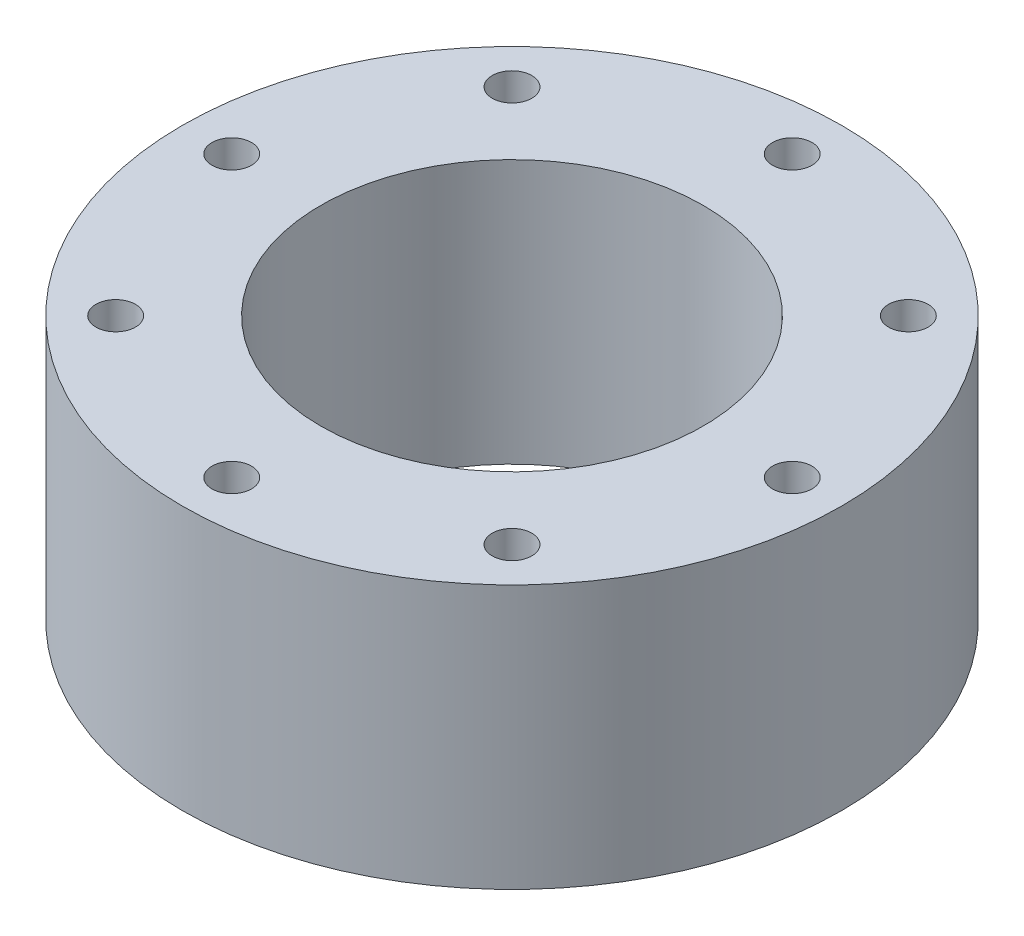
ISO-10303-21;
HEADER;
FILE_DESCRIPTION(('STEP AP214'),'2;1');
FILE_NAME('part.step','',(''),(''),'','','');
FILE_SCHEMA(('AUTOMOTIVE_DESIGN { 1 0 10303 214 1 1 1 1 }'));
ENDSEC;
DATA;
#1=APPLICATION_CONTEXT('core data for automotive mechanical design processes');
#2=APPLICATION_PROTOCOL_DEFINITION('international standard','automotive_design',2000,#1);
#3=PRODUCT_CONTEXT('',#1,'mechanical');
#4=PRODUCT('Part','Part','',(#3));
#5=PRODUCT_RELATED_PRODUCT_CATEGORY('part','',(#4));
#6=PRODUCT_DEFINITION_FORMATION('','',#4);
#7=PRODUCT_DEFINITION_CONTEXT('part definition',#1,'design');
#8=PRODUCT_DEFINITION('design','',#6,#7);
#9=PRODUCT_DEFINITION_SHAPE('','',#8);
#10=(LENGTH_UNIT() NAMED_UNIT(*) SI_UNIT(.MILLI.,.METRE.));
#11=(NAMED_UNIT(*) PLANE_ANGLE_UNIT() SI_UNIT($,.RADIAN.));
#12=(NAMED_UNIT(*) SI_UNIT($,.STERADIAN.) SOLID_ANGLE_UNIT());
#13=UNCERTAINTY_MEASURE_WITH_UNIT(LENGTH_MEASURE(1.E-05),#10,'distance_accuracy_value','');
#14=(GEOMETRIC_REPRESENTATION_CONTEXT(3) GLOBAL_UNCERTAINTY_ASSIGNED_CONTEXT((#13)) GLOBAL_UNIT_ASSIGNED_CONTEXT((#10,
#11,#12)) REPRESENTATION_CONTEXT('',''));
#15=CARTESIAN_POINT('',(0.,0.,0.));
#16=DIRECTION('',(0.,0.,1.));
#17=DIRECTION('',(1.,0.,0.));
#18=AXIS2_PLACEMENT_3D('',#15,#16,#17);
#19=CARTESIAN_POINT('',(0.,10.,0.));
#20=DIRECTION('',(0.,1.,0.));
#21=DIRECTION('',(0.,0.,1.));
#22=AXIS2_PLACEMENT_3D('',#19,#20,#21);
#23=PLANE('',#22);
#24=CARTESIAN_POINT('',(15.0260191002141,10.,15.0260191002142));
#25=DIRECTION('',(0.,1.,0.));
#26=DIRECTION('',(0.,0.,1.));
#27=AXIS2_PLACEMENT_3D('',#24,#25,#26);
#28=CIRCLE('',#27,1.5);
#29=CARTESIAN_POINT('',(15.0260191002141,10.,16.5260191002142));
#30=VERTEX_POINT('',#29);
#31=EDGE_CURVE('E83',#30,#30,#28,.T.);
#32=ORIENTED_EDGE('',*,*,#31,.F.);
#33=EDGE_LOOP('',(#32));
#34=FACE_BOUND('',#33,.T.);
#35=CARTESIAN_POINT('',(15.0260191002141,10.,-15.0260191002142));
#36=DIRECTION('',(0.,1.,0.));
#37=DIRECTION('',(0.,0.,1.));
#38=AXIS2_PLACEMENT_3D('',#35,#36,#37);
#39=CIRCLE('',#38,1.5);
#40=CARTESIAN_POINT('',(15.0260191002141,10.,-13.5260191002142));
#41=VERTEX_POINT('',#40);
#42=EDGE_CURVE('E71',#41,#41,#39,.T.);
#43=ORIENTED_EDGE('',*,*,#42,.F.);
#44=EDGE_LOOP('',(#43));
#45=FACE_BOUND('',#44,.T.);
#46=CARTESIAN_POINT('',(-15.0260191002141,10.,-15.0260191002142));
#47=DIRECTION('',(0.,1.,0.));
#48=DIRECTION('',(0.,0.,1.));
#49=AXIS2_PLACEMENT_3D('',#46,#47,#48);
#50=CIRCLE('',#49,1.5);
#51=CARTESIAN_POINT('',(-15.0260191002141,10.,-13.5260191002142));
#52=VERTEX_POINT('',#51);
#53=EDGE_CURVE('E59',#52,#52,#50,.T.);
#54=ORIENTED_EDGE('',*,*,#53,.F.);
#55=EDGE_LOOP('',(#54));
#56=FACE_BOUND('',#55,.T.);
#57=CARTESIAN_POINT('',(-15.0260191002141,10.,15.0260191002142));
#58=DIRECTION('',(0.,1.,0.));
#59=DIRECTION('',(0.,0.,1.));
#60=AXIS2_PLACEMENT_3D('',#57,#58,#59);
#61=CIRCLE('',#60,1.5);
#62=CARTESIAN_POINT('',(-15.0260191002141,10.,16.5260191002142));
#63=VERTEX_POINT('',#62);
#64=EDGE_CURVE('E47',#63,#63,#61,.T.);
#65=ORIENTED_EDGE('',*,*,#64,.F.);
#66=EDGE_LOOP('',(#65));
#67=FACE_BOUND('',#66,.T.);
#68=CARTESIAN_POINT('',(0.,10.,0.));
#69=DIRECTION('',(0.,1.,0.));
#70=DIRECTION('',(0.,0.,1.));
#71=AXIS2_PLACEMENT_3D('',#68,#69,#70);
#72=CIRCLE('',#71,25.);
#73=CARTESIAN_POINT('',(0.,10.,25.));
#74=VERTEX_POINT('',#73);
#75=EDGE_CURVE('E10',#74,#74,#72,.T.);
#76=ORIENTED_EDGE('',*,*,#75,.T.);
#77=EDGE_LOOP('',(#76));
#78=FACE_BOUND('',#77,.T.);
#79=CARTESIAN_POINT('',(0.,10.,21.25));
#80=DIRECTION('',(0.,1.,0.));
#81=DIRECTION('',(0.,0.,1.));
#82=AXIS2_PLACEMENT_3D('',#79,#80,#81);
#83=CIRCLE('',#82,1.5);
#84=CARTESIAN_POINT('',(0.,10.,22.75));
#85=VERTEX_POINT('',#84);
#86=EDGE_CURVE('E42',#85,#85,#83,.T.);
#87=ORIENTED_EDGE('',*,*,#86,.F.);
#88=EDGE_LOOP('',(#87));
#89=FACE_BOUND('',#88,.T.);
#90=CARTESIAN_POINT('',(-21.25,10.,0.));
#91=DIRECTION('',(0.,1.,0.));
#92=DIRECTION('',(0.,0.,1.));
#93=AXIS2_PLACEMENT_3D('',#90,#91,#92);
#94=CIRCLE('',#93,1.5);
#95=CARTESIAN_POINT('',(-21.25,10.,1.5));
#96=VERTEX_POINT('',#95);
#97=EDGE_CURVE('E53',#96,#96,#94,.T.);
#98=ORIENTED_EDGE('',*,*,#97,.F.);
#99=EDGE_LOOP('',(#98));
#100=FACE_BOUND('',#99,.T.);
#101=CARTESIAN_POINT('',(0.,10.,-21.25));
#102=DIRECTION('',(0.,1.,0.));
#103=DIRECTION('',(0.,0.,1.));
#104=AXIS2_PLACEMENT_3D('',#101,#102,#103);
#105=CIRCLE('',#104,1.5);
#106=CARTESIAN_POINT('',(0.,10.,-19.75));
#107=VERTEX_POINT('',#106);
#108=EDGE_CURVE('E65',#107,#107,#105,.T.);
#109=ORIENTED_EDGE('',*,*,#108,.F.);
#110=EDGE_LOOP('',(#109));
#111=FACE_BOUND('',#110,.T.);
#112=CARTESIAN_POINT('',(21.25,10.,0.));
#113=DIRECTION('',(0.,1.,0.));
#114=DIRECTION('',(0.,0.,1.));
#115=AXIS2_PLACEMENT_3D('',#112,#113,#114);
#116=CIRCLE('',#115,1.5);
#117=CARTESIAN_POINT('',(21.25,10.,1.5));
#118=VERTEX_POINT('',#117);
#119=EDGE_CURVE('E77',#118,#118,#116,.T.);
#120=ORIENTED_EDGE('',*,*,#119,.F.);
#121=EDGE_LOOP('',(#120));
#122=FACE_BOUND('',#121,.T.);
#123=CARTESIAN_POINT('',(0.,10.,0.));
#124=DIRECTION('',(0.,1.,0.));
#125=DIRECTION('',(0.,0.,1.));
#126=AXIS2_PLACEMENT_3D('',#123,#124,#125);
#127=CIRCLE('',#126,14.5);
#128=CARTESIAN_POINT('',(0.,10.,14.5));
#129=VERTEX_POINT('',#128);
#130=EDGE_CURVE('E89',#129,#129,#127,.T.);
#131=ORIENTED_EDGE('',*,*,#130,.F.);
#132=EDGE_LOOP('',(#131));
#133=FACE_BOUND('',#132,.T.);
#134=ADVANCED_FACE('F31',(#34,#45,#56,#67,#78,#89,#100,#111,#122,#133),#23,.T.);
#135=CARTESIAN_POINT('',(0.,-10.,0.));
#136=DIRECTION('',(0.,1.,0.));
#137=DIRECTION('',(0.,0.,1.));
#138=AXIS2_PLACEMENT_3D('',#135,#136,#137);
#139=PLANE('',#138);
#140=CARTESIAN_POINT('',(0.,-10.,0.));
#141=DIRECTION('',(0.,1.,0.));
#142=DIRECTION('',(0.,0.,1.));
#143=AXIS2_PLACEMENT_3D('',#140,#141,#142);
#144=CIRCLE('',#143,25.);
#145=CARTESIAN_POINT('',(0.,-10.,25.));
#146=VERTEX_POINT('',#145);
#147=EDGE_CURVE('E35',#146,#146,#144,.T.);
#148=ORIENTED_EDGE('',*,*,#147,.F.);
#149=EDGE_LOOP('',(#148));
#150=FACE_BOUND('',#149,.T.);
#151=CARTESIAN_POINT('',(0.,-10.,21.25));
#152=DIRECTION('',(0.,1.,0.));
#153=DIRECTION('',(0.,0.,1.));
#154=AXIS2_PLACEMENT_3D('',#151,#152,#153);
#155=CIRCLE('',#154,1.5);
#156=CARTESIAN_POINT('',(0.,-10.,22.75));
#157=VERTEX_POINT('',#156);
#158=EDGE_CURVE('E44',#157,#157,#155,.T.);
#159=ORIENTED_EDGE('',*,*,#158,.T.);
#160=EDGE_LOOP('',(#159));
#161=FACE_BOUND('',#160,.T.);
#162=CARTESIAN_POINT('',(-15.0260191002141,-10.,15.0260191002142));
#163=DIRECTION('',(0.,1.,0.));
#164=DIRECTION('',(0.,0.,1.));
#165=AXIS2_PLACEMENT_3D('',#162,#163,#164);
#166=CIRCLE('',#165,1.5);
#167=CARTESIAN_POINT('',(-15.0260191002141,-10.,16.5260191002142));
#168=VERTEX_POINT('',#167);
#169=EDGE_CURVE('E50',#168,#168,#166,.T.);
#170=ORIENTED_EDGE('',*,*,#169,.T.);
#171=EDGE_LOOP('',(#170));
#172=FACE_BOUND('',#171,.T.);
#173=CARTESIAN_POINT('',(-21.25,-10.,0.));
#174=DIRECTION('',(0.,1.,0.));
#175=DIRECTION('',(0.,0.,1.));
#176=AXIS2_PLACEMENT_3D('',#173,#174,#175);
#177=CIRCLE('',#176,1.5);
#178=CARTESIAN_POINT('',(-21.25,-10.,1.5));
#179=VERTEX_POINT('',#178);
#180=EDGE_CURVE('E56',#179,#179,#177,.T.);
#181=ORIENTED_EDGE('',*,*,#180,.T.);
#182=EDGE_LOOP('',(#181));
#183=FACE_BOUND('',#182,.T.);
#184=CARTESIAN_POINT('',(-15.0260191002141,-10.,-15.0260191002142));
#185=DIRECTION('',(0.,1.,0.));
#186=DIRECTION('',(0.,0.,1.));
#187=AXIS2_PLACEMENT_3D('',#184,#185,#186);
#188=CIRCLE('',#187,1.5);
#189=CARTESIAN_POINT('',(-15.0260191002141,-10.,-13.5260191002142));
#190=VERTEX_POINT('',#189);
#191=EDGE_CURVE('E62',#190,#190,#188,.T.);
#192=ORIENTED_EDGE('',*,*,#191,.T.);
#193=EDGE_LOOP('',(#192));
#194=FACE_BOUND('',#193,.T.);
#195=CARTESIAN_POINT('',(0.,-10.,-21.25));
#196=DIRECTION('',(0.,1.,0.));
#197=DIRECTION('',(0.,0.,1.));
#198=AXIS2_PLACEMENT_3D('',#195,#196,#197);
#199=CIRCLE('',#198,1.5);
#200=CARTESIAN_POINT('',(0.,-10.,-19.75));
#201=VERTEX_POINT('',#200);
#202=EDGE_CURVE('E68',#201,#201,#199,.T.);
#203=ORIENTED_EDGE('',*,*,#202,.T.);
#204=EDGE_LOOP('',(#203));
#205=FACE_BOUND('',#204,.T.);
#206=CARTESIAN_POINT('',(15.0260191002141,-10.,-15.0260191002142));
#207=DIRECTION('',(0.,1.,0.));
#208=DIRECTION('',(0.,0.,1.));
#209=AXIS2_PLACEMENT_3D('',#206,#207,#208);
#210=CIRCLE('',#209,1.5);
#211=CARTESIAN_POINT('',(15.0260191002141,-10.,-13.5260191002142));
#212=VERTEX_POINT('',#211);
#213=EDGE_CURVE('E74',#212,#212,#210,.T.);
#214=ORIENTED_EDGE('',*,*,#213,.T.);
#215=EDGE_LOOP('',(#214));
#216=FACE_BOUND('',#215,.T.);
#217=CARTESIAN_POINT('',(21.25,-10.,0.));
#218=DIRECTION('',(0.,1.,0.));
#219=DIRECTION('',(0.,0.,1.));
#220=AXIS2_PLACEMENT_3D('',#217,#218,#219);
#221=CIRCLE('',#220,1.5);
#222=CARTESIAN_POINT('',(21.25,-10.,1.5));
#223=VERTEX_POINT('',#222);
#224=EDGE_CURVE('E80',#223,#223,#221,.T.);
#225=ORIENTED_EDGE('',*,*,#224,.T.);
#226=EDGE_LOOP('',(#225));
#227=FACE_BOUND('',#226,.T.);
#228=CARTESIAN_POINT('',(15.0260191002141,-10.,15.0260191002142));
#229=DIRECTION('',(0.,1.,0.));
#230=DIRECTION('',(0.,0.,1.));
#231=AXIS2_PLACEMENT_3D('',#228,#229,#230);
#232=CIRCLE('',#231,1.5);
#233=CARTESIAN_POINT('',(15.0260191002141,-10.,16.5260191002142));
#234=VERTEX_POINT('',#233);
#235=EDGE_CURVE('E86',#234,#234,#232,.T.);
#236=ORIENTED_EDGE('',*,*,#235,.T.);
#237=EDGE_LOOP('',(#236));
#238=FACE_BOUND('',#237,.T.);
#239=CARTESIAN_POINT('',(0.,-10.,0.));
#240=DIRECTION('',(0.,1.,0.));
#241=DIRECTION('',(0.,0.,1.));
#242=AXIS2_PLACEMENT_3D('',#239,#240,#241);
#243=CIRCLE('',#242,14.5);
#244=CARTESIAN_POINT('',(0.,-10.,14.5));
#245=VERTEX_POINT('',#244);
#246=EDGE_CURVE('E92',#245,#245,#243,.T.);
#247=ORIENTED_EDGE('',*,*,#246,.T.);
#248=EDGE_LOOP('',(#247));
#249=FACE_BOUND('',#248,.T.);
#250=ADVANCED_FACE('F102',(#150,#161,#172,#183,#194,#205,#216,#227,#238,#249),#139,.F.);
#251=CARTESIAN_POINT('',(0.,10.,0.));
#252=DIRECTION('',(0.,-1.,0.));
#253=DIRECTION('',(0.,0.,-1.));
#254=AXIS2_PLACEMENT_3D('',#251,#252,#253);
#255=CYLINDRICAL_SURFACE('',#254,25.);
#256=ORIENTED_EDGE('',*,*,#75,.F.);
#257=EDGE_LOOP('',(#256));
#258=FACE_BOUND('',#257,.T.);
#259=ORIENTED_EDGE('',*,*,#147,.T.);
#260=EDGE_LOOP('',(#259));
#261=FACE_BOUND('',#260,.T.);
#262=ADVANCED_FACE('F33',(#258,#261),#255,.T.);
#263=CARTESIAN_POINT('',(0.,10.,21.25));
#264=DIRECTION('',(0.,-1.,0.));
#265=DIRECTION('',(0.,0.,-1.));
#266=AXIS2_PLACEMENT_3D('',#263,#264,#265);
#267=CYLINDRICAL_SURFACE('',#266,1.5);
#268=ORIENTED_EDGE('',*,*,#86,.T.);
#269=EDGE_LOOP('',(#268));
#270=FACE_BOUND('',#269,.T.);
#271=ORIENTED_EDGE('',*,*,#158,.F.);
#272=EDGE_LOOP('',(#271));
#273=FACE_BOUND('',#272,.T.);
#274=ADVANCED_FACE('F112',(#270,#273),#267,.F.);
#275=CARTESIAN_POINT('',(-15.0260191002141,10.,15.0260191002142));
#276=DIRECTION('',(0.,-1.,0.));
#277=DIRECTION('',(0.,0.,-1.));
#278=AXIS2_PLACEMENT_3D('',#275,#276,#277);
#279=CYLINDRICAL_SURFACE('',#278,1.5);
#280=ORIENTED_EDGE('',*,*,#64,.T.);
#281=EDGE_LOOP('',(#280));
#282=FACE_BOUND('',#281,.T.);
#283=ORIENTED_EDGE('',*,*,#169,.F.);
#284=EDGE_LOOP('',(#283));
#285=FACE_BOUND('',#284,.T.);
#286=ADVANCED_FACE('F115',(#282,#285),#279,.F.);
#287=CARTESIAN_POINT('',(-21.25,10.,0.));
#288=DIRECTION('',(0.,-1.,0.));
#289=DIRECTION('',(0.,0.,-1.));
#290=AXIS2_PLACEMENT_3D('',#287,#288,#289);
#291=CYLINDRICAL_SURFACE('',#290,1.5);
#292=ORIENTED_EDGE('',*,*,#97,.T.);
#293=EDGE_LOOP('',(#292));
#294=FACE_BOUND('',#293,.T.);
#295=ORIENTED_EDGE('',*,*,#180,.F.);
#296=EDGE_LOOP('',(#295));
#297=FACE_BOUND('',#296,.T.);
#298=ADVANCED_FACE('F119',(#294,#297),#291,.F.);
#299=CARTESIAN_POINT('',(-15.0260191002141,10.,-15.0260191002142));
#300=DIRECTION('',(0.,-1.,0.));
#301=DIRECTION('',(0.,0.,-1.));
#302=AXIS2_PLACEMENT_3D('',#299,#300,#301);
#303=CYLINDRICAL_SURFACE('',#302,1.5);
#304=ORIENTED_EDGE('',*,*,#53,.T.);
#305=EDGE_LOOP('',(#304));
#306=FACE_BOUND('',#305,.T.);
#307=ORIENTED_EDGE('',*,*,#191,.F.);
#308=EDGE_LOOP('',(#307));
#309=FACE_BOUND('',#308,.T.);
#310=ADVANCED_FACE('F123',(#306,#309),#303,.F.);
#311=CARTESIAN_POINT('',(0.,10.,-21.25));
#312=DIRECTION('',(0.,-1.,0.));
#313=DIRECTION('',(0.,0.,-1.));
#314=AXIS2_PLACEMENT_3D('',#311,#312,#313);
#315=CYLINDRICAL_SURFACE('',#314,1.5);
#316=ORIENTED_EDGE('',*,*,#108,.T.);
#317=EDGE_LOOP('',(#316));
#318=FACE_BOUND('',#317,.T.);
#319=ORIENTED_EDGE('',*,*,#202,.F.);
#320=EDGE_LOOP('',(#319));
#321=FACE_BOUND('',#320,.T.);
#322=ADVANCED_FACE('F127',(#318,#321),#315,.F.);
#323=CARTESIAN_POINT('',(15.0260191002141,10.,-15.0260191002142));
#324=DIRECTION('',(0.,-1.,0.));
#325=DIRECTION('',(0.,0.,-1.));
#326=AXIS2_PLACEMENT_3D('',#323,#324,#325);
#327=CYLINDRICAL_SURFACE('',#326,1.5);
#328=ORIENTED_EDGE('',*,*,#42,.T.);
#329=EDGE_LOOP('',(#328));
#330=FACE_BOUND('',#329,.T.);
#331=ORIENTED_EDGE('',*,*,#213,.F.);
#332=EDGE_LOOP('',(#331));
#333=FACE_BOUND('',#332,.T.);
#334=ADVANCED_FACE('F131',(#330,#333),#327,.F.);
#335=CARTESIAN_POINT('',(21.25,10.,0.));
#336=DIRECTION('',(0.,-1.,0.));
#337=DIRECTION('',(0.,0.,-1.));
#338=AXIS2_PLACEMENT_3D('',#335,#336,#337);
#339=CYLINDRICAL_SURFACE('',#338,1.5);
#340=ORIENTED_EDGE('',*,*,#119,.T.);
#341=EDGE_LOOP('',(#340));
#342=FACE_BOUND('',#341,.T.);
#343=ORIENTED_EDGE('',*,*,#224,.F.);
#344=EDGE_LOOP('',(#343));
#345=FACE_BOUND('',#344,.T.);
#346=ADVANCED_FACE('F135',(#342,#345),#339,.F.);
#347=CARTESIAN_POINT('',(15.0260191002141,10.,15.0260191002142));
#348=DIRECTION('',(0.,-1.,0.));
#349=DIRECTION('',(0.,0.,-1.));
#350=AXIS2_PLACEMENT_3D('',#347,#348,#349);
#351=CYLINDRICAL_SURFACE('',#350,1.5);
#352=ORIENTED_EDGE('',*,*,#31,.T.);
#353=EDGE_LOOP('',(#352));
#354=FACE_BOUND('',#353,.T.);
#355=ORIENTED_EDGE('',*,*,#235,.F.);
#356=EDGE_LOOP('',(#355));
#357=FACE_BOUND('',#356,.T.);
#358=ADVANCED_FACE('F139',(#354,#357),#351,.F.);
#359=CARTESIAN_POINT('',(0.,10.,0.));
#360=DIRECTION('',(0.,-1.,0.));
#361=DIRECTION('',(0.,0.,-1.));
#362=AXIS2_PLACEMENT_3D('',#359,#360,#361);
#363=CYLINDRICAL_SURFACE('',#362,14.5);
#364=ORIENTED_EDGE('',*,*,#130,.T.);
#365=EDGE_LOOP('',(#364));
#366=FACE_BOUND('',#365,.T.);
#367=ORIENTED_EDGE('',*,*,#246,.F.);
#368=EDGE_LOOP('',(#367));
#369=FACE_BOUND('',#368,.T.);
#370=ADVANCED_FACE('F98',(#366,#369),#363,.F.);
#371=CLOSED_SHELL('',(#134,#250,#262,#274,#286,#298,#310,#322,#334,#346,#358,#370));
#372=MANIFOLD_SOLID_BREP('B2',#371);
#373=ADVANCED_BREP_SHAPE_REPRESENTATION('',(#18,#372),#14);
#374=SHAPE_DEFINITION_REPRESENTATION(#9,#373);
ENDSEC;
END-ISO-10303-21;
